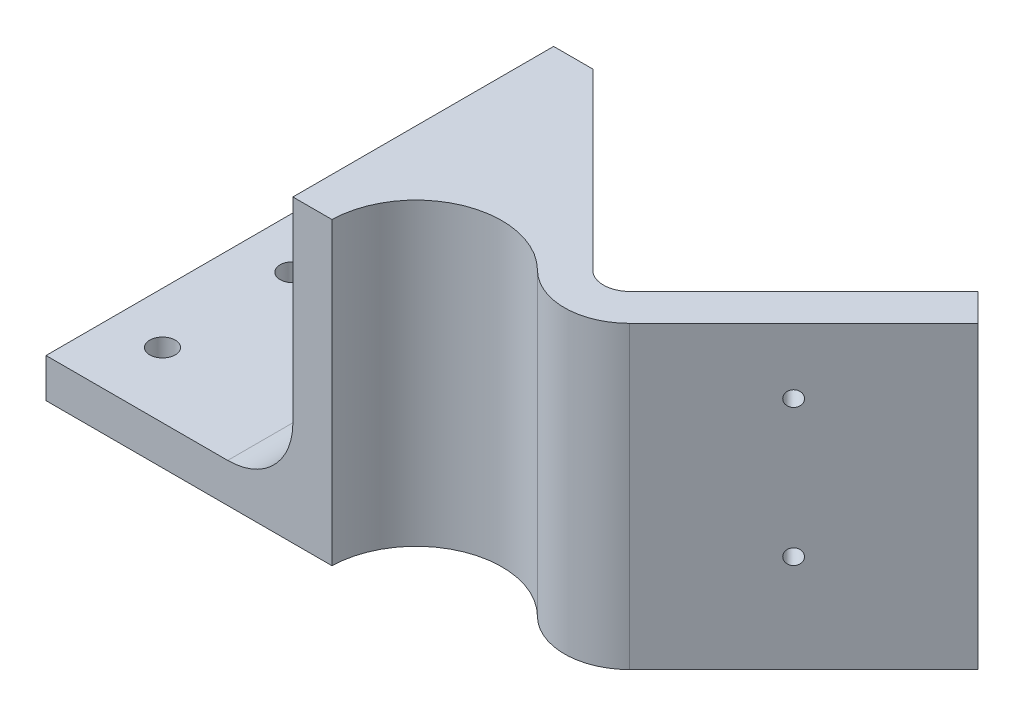
ISO-10303-21;
HEADER;
FILE_DESCRIPTION(('STEP AP214'),'2;1');
FILE_NAME('part.step','',(''),(''),'','','');
FILE_SCHEMA(('AUTOMOTIVE_DESIGN { 1 0 10303 214 1 1 1 1 }'));
ENDSEC;
DATA;
#1=APPLICATION_CONTEXT('core data for automotive mechanical design processes');
#2=APPLICATION_PROTOCOL_DEFINITION('international standard','automotive_design',2000,#1);
#3=PRODUCT_CONTEXT('',#1,'mechanical');
#4=PRODUCT('Part','Part','',(#3));
#5=PRODUCT_RELATED_PRODUCT_CATEGORY('part','',(#4));
#6=PRODUCT_DEFINITION_FORMATION('','',#4);
#7=PRODUCT_DEFINITION_CONTEXT('part definition',#1,'design');
#8=PRODUCT_DEFINITION('design','',#6,#7);
#9=PRODUCT_DEFINITION_SHAPE('','',#8);
#10=(LENGTH_UNIT() NAMED_UNIT(*) SI_UNIT(.MILLI.,.METRE.));
#11=(NAMED_UNIT(*) PLANE_ANGLE_UNIT() SI_UNIT($,.RADIAN.));
#12=(NAMED_UNIT(*) SI_UNIT($,.STERADIAN.) SOLID_ANGLE_UNIT());
#13=UNCERTAINTY_MEASURE_WITH_UNIT(LENGTH_MEASURE(1.E-05),#10,'distance_accuracy_value','');
#14=(GEOMETRIC_REPRESENTATION_CONTEXT(3) GLOBAL_UNCERTAINTY_ASSIGNED_CONTEXT((#13)) GLOBAL_UNIT_ASSIGNED_CONTEXT((#10,
#11,#12)) REPRESENTATION_CONTEXT('',''));
#15=CARTESIAN_POINT('',(0.,0.,0.));
#16=DIRECTION('',(0.,0.,1.));
#17=DIRECTION('',(1.,0.,0.));
#18=AXIS2_PLACEMENT_3D('',#15,#16,#17);
#19=CARTESIAN_POINT('',(0.,50.8,0.));
#20=DIRECTION('',(0.,-1.,0.));
#21=DIRECTION('',(0.,0.,-1.));
#22=AXIS2_PLACEMENT_3D('',#19,#20,#21);
#23=CYLINDRICAL_SURFACE('',#22,5.08);
#24=CARTESIAN_POINT('',(0.,0.,0.));
#25=DIRECTION('',(0.,1.,0.));
#26=DIRECTION('',(0.,0.,1.));
#27=AXIS2_PLACEMENT_3D('',#24,#25,#26);
#28=CIRCLE('',#27,5.08);
#29=CARTESIAN_POINT('',(-3.59210244842766,0.,3.59210244842767));
#30=VERTEX_POINT('',#29);
#31=CARTESIAN_POINT('',(3.59210244842765,0.,3.59210244842767));
#32=VERTEX_POINT('',#31);
#33=EDGE_CURVE('E226',#30,#32,#28,.T.);
#34=ORIENTED_EDGE('',*,*,#33,.F.);
#35=DIRECTION('',(0.,-1.,0.));
#36=VECTOR('',#35,1.);
#37=CARTESIAN_POINT('',(-3.59210244842766,50.8,3.59210244842767));
#38=LINE('',#37,#36);
#39=CARTESIAN_POINT('',(-3.59210244842766,50.8,3.59210244842767));
#40=VERTEX_POINT('',#39);
#41=EDGE_CURVE('E283',#40,#30,#38,.T.);
#42=ORIENTED_EDGE('',*,*,#41,.F.);
#43=CARTESIAN_POINT('',(0.,50.8,0.));
#44=DIRECTION('',(0.,1.,0.));
#45=DIRECTION('',(0.,0.,1.));
#46=AXIS2_PLACEMENT_3D('',#43,#44,#45);
#47=CIRCLE('',#46,5.08);
#48=CARTESIAN_POINT('',(3.59210244842765,50.8,3.59210244842767));
#49=VERTEX_POINT('',#48);
#50=EDGE_CURVE('E231',#40,#49,#47,.T.);
#51=ORIENTED_EDGE('',*,*,#50,.T.);
#52=DIRECTION('',(0.,-1.,0.));
#53=VECTOR('',#52,1.);
#54=CARTESIAN_POINT('',(3.59210244842765,50.8,3.59210244842767));
#55=LINE('',#54,#53);
#56=EDGE_CURVE('E261',#49,#32,#55,.T.);
#57=ORIENTED_EDGE('',*,*,#56,.T.);
#58=EDGE_LOOP('',(#34,#42,#51,#57));
#59=FACE_BOUND('',#58,.T.);
#60=ADVANCED_FACE('F45',(#59),#23,.F.);
#61=CARTESIAN_POINT('',(-3.59210244842765,50.8,3.59210244842767));
#62=DIRECTION('',(-0.707106781186546,0.,0.707106781186549));
#63=DIRECTION('',(0.707106781186549,0.,0.707106781186546));
#64=AXIS2_PLACEMENT_3D('',#61,#62,#63);
#65=PLANE('',#64);
#66=CARTESIAN_POINT('',(-19.5669788146433,38.1,-12.3827739177879));
#67=DIRECTION('',(0.707106781186546,0.,-0.707106781186549));
#68=DIRECTION('',(-0.707106781186549,0.,-0.707106781186546));
#69=AXIS2_PLACEMENT_3D('',#66,#67,#68);
#70=CIRCLE('',#69,1.5);
#71=CARTESIAN_POINT('',(-20.6276389864232,38.1,-13.4434340895678));
#72=VERTEX_POINT('',#71);
#73=EDGE_CURVE('E409',#72,#72,#70,.T.);
#74=ORIENTED_EDGE('',*,*,#73,.F.);
#75=EDGE_LOOP('',(#74));
#76=FACE_BOUND('',#75,.T.);
#77=CARTESIAN_POINT('',(-19.5669788146433,11.43,-12.3827739177879));
#78=DIRECTION('',(0.707106781186546,0.,-0.707106781186549));
#79=DIRECTION('',(-0.707106781186549,0.,-0.707106781186546));
#80=AXIS2_PLACEMENT_3D('',#77,#78,#79);
#81=CIRCLE('',#80,1.5);
#82=CARTESIAN_POINT('',(-20.6276389864232,11.43,-13.4434340895678));
#83=VERTEX_POINT('',#82);
#84=EDGE_CURVE('E411',#83,#83,#81,.T.);
#85=ORIENTED_EDGE('',*,*,#84,.F.);
#86=EDGE_LOOP('',(#85));
#87=FACE_BOUND('',#86,.T.);
#88=DIRECTION('',(-0.707106781186549,0.,-0.707106781186546));
#89=VECTOR('',#88,1.);
#90=CARTESIAN_POINT('',(-3.59210244842765,0.,3.59210244842767));
#91=LINE('',#90,#89);
#92=CARTESIAN_POINT('',(-20.5597967526047,0.,-13.3755918557493));
#93=VERTEX_POINT('',#92);
#94=EDGE_CURVE('E156',#30,#93,#91,.T.);
#95=ORIENTED_EDGE('',*,*,#94,.T.);
#96=DIRECTION('',(0.,1.,0.));
#97=VECTOR('',#96,1.);
#98=CARTESIAN_POINT('',(-20.5597967526047,-7.62,-13.3755918557493));
#99=LINE('',#98,#97);
#100=CARTESIAN_POINT('',(-20.5597967526047,-7.62,-13.3755918557493));
#101=VERTEX_POINT('',#100);
#102=EDGE_CURVE('E150',#101,#93,#99,.T.);
#103=ORIENTED_EDGE('',*,*,#102,.F.);
#104=DIRECTION('',(-0.707106781186549,0.,-0.707106781186546));
#105=VECTOR('',#104,1.);
#106=CARTESIAN_POINT('',(-3.59210244842765,-7.62,3.59210244842767));
#107=LINE('',#106,#105);
#108=CARTESIAN_POINT('',(-37.5274910567817,-7.62,-30.3432861599262));
#109=VERTEX_POINT('',#108);
#110=EDGE_CURVE('E154',#101,#109,#107,.T.);
#111=ORIENTED_EDGE('',*,*,#110,.T.);
#112=DIRECTION('',(0.,-1.,0.));
#113=VECTOR('',#112,1.);
#114=CARTESIAN_POINT('',(-37.5274910567817,50.8,-30.3432861599262));
#115=LINE('',#114,#113);
#116=CARTESIAN_POINT('',(-37.5274910567817,50.8,-30.3432861599262));
#117=VERTEX_POINT('',#116);
#118=EDGE_CURVE('E281',#117,#109,#115,.T.);
#119=ORIENTED_EDGE('',*,*,#118,.F.);
#120=DIRECTION('',(-0.707106781186549,0.,-0.707106781186546));
#121=VECTOR('',#120,1.);
#122=CARTESIAN_POINT('',(-3.59210244842765,50.8,3.59210244842767));
#123=LINE('',#122,#121);
#124=EDGE_CURVE('E234',#40,#117,#123,.T.);
#125=ORIENTED_EDGE('',*,*,#124,.F.);
#126=ORIENTED_EDGE('',*,*,#41,.T.);
#127=EDGE_LOOP('',(#95,#103,#111,#119,#125,#126));
#128=FACE_BOUND('',#127,.T.);
#129=ADVANCED_FACE('F152',(#76,#87,#128),#65,.F.);
#130=CARTESIAN_POINT('',(0.,50.8,-30.3432861599262));
#131=DIRECTION('',(0.,0.,-1.));
#132=DIRECTION('',(-1.,0.,0.));
#133=AXIS2_PLACEMENT_3D('',#130,#131,#132);
#134=PLANE('',#133);
#135=ORIENTED_EDGE('',*,*,#118,.T.);
#136=DIRECTION('',(1.,0.,0.));
#137=VECTOR('',#136,1.);
#138=CARTESIAN_POINT('',(0.,-7.62,-30.3432861599262));
#139=LINE('',#138,#137);
#140=CARTESIAN_POINT('',(-93.2474910567817,-7.62,-30.3432861599262));
#141=VERTEX_POINT('',#140);
#142=EDGE_CURVE('E173',#141,#109,#139,.T.);
#143=ORIENTED_EDGE('',*,*,#142,.F.);
#144=DIRECTION('',(0.,1.,0.));
#145=VECTOR('',#144,1.);
#146=CARTESIAN_POINT('',(-93.2474910567817,-7.62,-30.3432861599262));
#147=LINE('',#146,#145);
#148=CARTESIAN_POINT('',(-93.2474910567817,0.,-30.3432861599262));
#149=VERTEX_POINT('',#148);
#150=EDGE_CURVE('E161',#141,#149,#147,.T.);
#151=ORIENTED_EDGE('',*,*,#150,.T.);
#152=DIRECTION('',(1.,0.,0.));
#153=VECTOR('',#152,1.);
#154=CARTESIAN_POINT('',(0.,0.,-30.3432861599262));
#155=LINE('',#154,#153);
#156=CARTESIAN_POINT('',(-57.8474910567817,0.,-30.3432861599262));
#157=VERTEX_POINT('',#156);
#158=EDGE_CURVE('E215',#149,#157,#155,.T.);
#159=ORIENTED_EDGE('',*,*,#158,.T.);
#160=CARTESIAN_POINT('',(-57.8474910567817,12.7,-30.3432861599262));
#161=DIRECTION('',(0.,0.,-1.));
#162=DIRECTION('',(-1.,0.,0.));
#163=AXIS2_PLACEMENT_3D('',#160,#161,#162);
#164=CIRCLE('',#163,12.7);
#165=CARTESIAN_POINT('',(-45.1474910567817,12.7,-30.3432861599262));
#166=VERTEX_POINT('',#165);
#167=EDGE_CURVE('E53',#157,#166,#164,.F.);
#168=ORIENTED_EDGE('',*,*,#167,.T.);
#169=DIRECTION('',(0.,-1.,0.));
#170=VECTOR('',#169,1.);
#171=CARTESIAN_POINT('',(-45.1474910567817,50.8,-30.3432861599262));
#172=LINE('',#171,#170);
#173=CARTESIAN_POINT('',(-45.1474910567817,50.8,-30.3432861599262));
#174=VERTEX_POINT('',#173);
#175=EDGE_CURVE('E279',#174,#166,#172,.T.);
#176=ORIENTED_EDGE('',*,*,#175,.F.);
#177=DIRECTION('',(1.,0.,0.));
#178=VECTOR('',#177,1.);
#179=CARTESIAN_POINT('',(0.,50.8,-30.3432861599262));
#180=LINE('',#179,#178);
#181=EDGE_CURVE('E237',#174,#117,#180,.T.);
#182=ORIENTED_EDGE('',*,*,#181,.T.);
#183=EDGE_LOOP('',(#135,#143,#151,#159,#168,#176,#182));
#184=FACE_BOUND('',#183,.T.);
#185=ADVANCED_FACE('F296',(#184),#134,.T.);
#186=CARTESIAN_POINT('',(-45.1474910567817,50.8,0.));
#187=DIRECTION('',(-1.,0.,0.));
#188=DIRECTION('',(0.,0.,1.));
#189=AXIS2_PLACEMENT_3D('',#186,#187,#188);
#190=PLANE('',#189);
#191=ORIENTED_EDGE('',*,*,#175,.T.);
#192=DIRECTION('',(0.,0.,-1.));
#193=VECTOR('',#192,1.);
#194=CARTESIAN_POINT('',(-45.1474910567817,12.7,20.4567138400737));
#195=LINE('',#194,#193);
#196=CARTESIAN_POINT('',(-45.1474910567817,12.7,20.4567138400737));
#197=VERTEX_POINT('',#196);
#198=EDGE_CURVE('E66',#166,#197,#195,.F.);
#199=ORIENTED_EDGE('',*,*,#198,.T.);
#200=DIRECTION('',(0.,-1.,0.));
#201=VECTOR('',#200,1.);
#202=CARTESIAN_POINT('',(-45.1474910567817,50.8,20.4567138400737));
#203=LINE('',#202,#201);
#204=CARTESIAN_POINT('',(-45.1474910567817,50.8,20.4567138400737));
#205=VERTEX_POINT('',#204);
#206=EDGE_CURVE('E277',#205,#197,#203,.T.);
#207=ORIENTED_EDGE('',*,*,#206,.F.);
#208=DIRECTION('',(0.,0.,-1.));
#209=VECTOR('',#208,1.);
#210=CARTESIAN_POINT('',(-45.1474910567817,50.8,0.));
#211=LINE('',#210,#209);
#212=EDGE_CURVE('E240',#205,#174,#211,.T.);
#213=ORIENTED_EDGE('',*,*,#212,.T.);
#214=EDGE_LOOP('',(#191,#199,#207,#213));
#215=FACE_BOUND('',#214,.T.);
#216=ADVANCED_FACE('F325',(#215),#190,.T.);
#217=CARTESIAN_POINT('',(0.,50.8,20.4567138400737));
#218=DIRECTION('',(0.,0.,1.));
#219=DIRECTION('',(1.,0.,0.));
#220=AXIS2_PLACEMENT_3D('',#217,#218,#219);
#221=PLANE('',#220);
#222=ORIENTED_EDGE('',*,*,#206,.T.);
#223=CARTESIAN_POINT('',(-57.8474910567817,12.7,20.4567138400737));
#224=DIRECTION('',(0.,0.,1.));
#225=DIRECTION('',(1.,0.,0.));
#226=AXIS2_PLACEMENT_3D('',#223,#224,#225);
#227=CIRCLE('',#226,12.7);
#228=CARTESIAN_POINT('',(-57.8474910567817,0.,20.4567138400737));
#229=VERTEX_POINT('',#228);
#230=EDGE_CURVE('E11',#197,#229,#227,.F.);
#231=ORIENTED_EDGE('',*,*,#230,.T.);
#232=DIRECTION('',(-1.,0.,0.));
#233=VECTOR('',#232,1.);
#234=CARTESIAN_POINT('',(0.,0.,20.4567138400737));
#235=LINE('',#234,#233);
#236=CARTESIAN_POINT('',(-93.2474910567817,0.,20.4567138400738));
#237=VERTEX_POINT('',#236);
#238=EDGE_CURVE('E221',#229,#237,#235,.T.);
#239=ORIENTED_EDGE('',*,*,#238,.T.);
#240=DIRECTION('',(0.,1.,0.));
#241=VECTOR('',#240,1.);
#242=CARTESIAN_POINT('',(-93.2474910567817,-7.62,20.4567138400738));
#243=LINE('',#242,#241);
#244=CARTESIAN_POINT('',(-93.2474910567817,-7.62,20.4567138400738));
#245=VERTEX_POINT('',#244);
#246=EDGE_CURVE('E227',#245,#237,#243,.T.);
#247=ORIENTED_EDGE('',*,*,#246,.F.);
#248=DIRECTION('',(-1.,0.,0.));
#249=VECTOR('',#248,1.);
#250=CARTESIAN_POINT('',(0.,-7.62,20.4567138400737));
#251=LINE('',#250,#249);
#252=CARTESIAN_POINT('',(-37.5274910567817,-7.62,20.4567138400737));
#253=VERTEX_POINT('',#252);
#254=EDGE_CURVE('E192',#253,#245,#251,.T.);
#255=ORIENTED_EDGE('',*,*,#254,.F.);
#256=DIRECTION('',(0.,-1.,0.));
#257=VECTOR('',#256,1.);
#258=CARTESIAN_POINT('',(-37.5274910567817,50.8,20.4567138400737));
#259=LINE('',#258,#257);
#260=CARTESIAN_POINT('',(-37.5274910567817,50.8,20.4567138400737));
#261=VERTEX_POINT('',#260);
#262=EDGE_CURVE('E275',#261,#253,#259,.T.);
#263=ORIENTED_EDGE('',*,*,#262,.F.);
#264=DIRECTION('',(-1.,0.,0.));
#265=VECTOR('',#264,1.);
#266=CARTESIAN_POINT('',(0.,50.8,20.4567138400737));
#267=LINE('',#266,#265);
#268=EDGE_CURVE('E243',#261,#205,#267,.T.);
#269=ORIENTED_EDGE('',*,*,#268,.T.);
#270=EDGE_LOOP('',(#222,#231,#239,#247,#255,#263,#269));
#271=FACE_BOUND('',#270,.T.);
#272=ADVANCED_FACE('F302',(#271),#221,.T.);
#273=CARTESIAN_POINT('',(-20.8064225922342,50.8,20.8064225922343));
#274=DIRECTION('',(0.,-1.,0.));
#275=DIRECTION('',(0.,0.,-1.));
#276=AXIS2_PLACEMENT_3D('',#273,#274,#275);
#277=CYLINDRICAL_SURFACE('',#276,16.7247250144037);
#278=ORIENTED_EDGE('',*,*,#262,.T.);
#279=CARTESIAN_POINT('',(-20.8064225922342,-7.62,20.8064225922343));
#280=DIRECTION('',(0.,1.,0.));
#281=DIRECTION('',(0.,0.,1.));
#282=AXIS2_PLACEMENT_3D('',#279,#280,#281);
#283=CIRCLE('',#282,16.7247250144037);
#284=CARTESIAN_POINT('',(-8.98025612106912,-7.62,8.98025612106917));
#285=VERTEX_POINT('',#284);
#286=EDGE_CURVE('E194',#285,#253,#283,.T.);
#287=ORIENTED_EDGE('',*,*,#286,.F.);
#288=DIRECTION('',(0.,-1.,0.));
#289=VECTOR('',#288,1.);
#290=CARTESIAN_POINT('',(-8.98025612106912,50.8,8.98025612106917));
#291=LINE('',#290,#289);
#292=CARTESIAN_POINT('',(-8.98025612106912,50.8,8.98025612106917));
#293=VERTEX_POINT('',#292);
#294=EDGE_CURVE('E273',#293,#285,#291,.T.);
#295=ORIENTED_EDGE('',*,*,#294,.F.);
#296=CARTESIAN_POINT('',(-20.8064225922342,50.8,20.8064225922343));
#297=DIRECTION('',(0.,1.,0.));
#298=DIRECTION('',(0.,0.,1.));
#299=AXIS2_PLACEMENT_3D('',#296,#297,#298);
#300=CIRCLE('',#299,16.7247250144037);
#301=EDGE_CURVE('E246',#293,#261,#300,.T.);
#302=ORIENTED_EDGE('',*,*,#301,.T.);
#303=EDGE_LOOP('',(#278,#287,#295,#302));
#304=FACE_BOUND('',#303,.T.);
#305=ADVANCED_FACE('F330',(#304),#277,.F.);
#306=CARTESIAN_POINT('',(0.,50.8,0.));
#307=DIRECTION('',(0.,-1.,0.));
#308=DIRECTION('',(0.,0.,-1.));
#309=AXIS2_PLACEMENT_3D('',#306,#307,#308);
#310=CYLINDRICAL_SURFACE('',#309,12.7);
#311=ORIENTED_EDGE('',*,*,#294,.T.);
#312=CARTESIAN_POINT('',(0.,-7.62,0.));
#313=DIRECTION('',(0.,1.,0.));
#314=DIRECTION('',(0.,0.,1.));
#315=AXIS2_PLACEMENT_3D('',#312,#313,#314);
#316=CIRCLE('',#315,12.7);
#317=CARTESIAN_POINT('',(8.98025612106913,-7.62,8.98025612106916));
#318=VERTEX_POINT('',#317);
#319=EDGE_CURVE('E197',#318,#285,#316,.F.);
#320=ORIENTED_EDGE('',*,*,#319,.F.);
#321=DIRECTION('',(0.,-1.,0.));
#322=VECTOR('',#321,1.);
#323=CARTESIAN_POINT('',(8.98025612106913,50.8,8.98025612106916));
#324=LINE('',#323,#322);
#325=CARTESIAN_POINT('',(8.98025612106913,50.8,8.98025612106916));
#326=VERTEX_POINT('',#325);
#327=EDGE_CURVE('E271',#326,#318,#324,.T.);
#328=ORIENTED_EDGE('',*,*,#327,.F.);
#329=CARTESIAN_POINT('',(0.,50.8,0.));
#330=DIRECTION('',(0.,1.,0.));
#331=DIRECTION('',(0.,0.,1.));
#332=AXIS2_PLACEMENT_3D('',#329,#330,#331);
#333=CIRCLE('',#332,12.7);
#334=EDGE_CURVE('E249',#326,#293,#333,.F.);
#335=ORIENTED_EDGE('',*,*,#334,.T.);
#336=EDGE_LOOP('',(#311,#320,#328,#335));
#337=FACE_BOUND('',#336,.T.);
#338=ADVANCED_FACE('F332',(#337),#310,.T.);
#339=CARTESIAN_POINT('',(8.98025612106913,50.8,8.98025612106917));
#340=DIRECTION('',(0.707106781186546,0.,0.707106781186549));
#341=DIRECTION('',(0.707106781186549,0.,-0.707106781186546));
#342=AXIS2_PLACEMENT_3D('',#339,#340,#341);
#343=PLANE('',#342);
#344=CARTESIAN_POINT('',(24.9551324872848,38.1,-6.99462024514645));
#345=DIRECTION('',(0.707106781186546,0.,0.707106781186549));
#346=DIRECTION('',(0.707106781186549,0.,-0.707106781186546));
#347=AXIS2_PLACEMENT_3D('',#344,#345,#346);
#348=CIRCLE('',#347,1.5);
#349=CARTESIAN_POINT('',(26.0157926590646,38.1,-8.05528041692627));
#350=VERTEX_POINT('',#349);
#351=EDGE_CURVE('E404',#350,#350,#348,.T.);
#352=ORIENTED_EDGE('',*,*,#351,.F.);
#353=EDGE_LOOP('',(#352));
#354=FACE_BOUND('',#353,.T.);
#355=CARTESIAN_POINT('',(24.9551324872848,11.43,-6.99462024514645));
#356=DIRECTION('',(0.707106781186546,0.,0.707106781186549));
#357=DIRECTION('',(0.707106781186549,0.,-0.707106781186546));
#358=AXIS2_PLACEMENT_3D('',#355,#356,#357);
#359=CIRCLE('',#358,1.5);
#360=CARTESIAN_POINT('',(26.0157926590646,11.43,-8.05528041692627));
#361=VERTEX_POINT('',#360);
#362=EDGE_CURVE('E393',#361,#361,#359,.T.);
#363=ORIENTED_EDGE('',*,*,#362,.F.);
#364=EDGE_LOOP('',(#363));
#365=FACE_BOUND('',#364,.T.);
#366=ORIENTED_EDGE('',*,*,#327,.T.);
#367=DIRECTION('',(-0.707106781186549,0.,0.707106781186546));
#368=VECTOR('',#367,1.);
#369=CARTESIAN_POINT('',(8.98025612106913,-7.62,8.98025612106917));
#370=LINE('',#369,#368);
#371=CARTESIAN_POINT('',(42.9156447294232,-7.62,-24.9551324872847));
#372=VERTEX_POINT('',#371);
#373=EDGE_CURVE('E200',#372,#318,#370,.T.);
#374=ORIENTED_EDGE('',*,*,#373,.F.);
#375=DIRECTION('',(0.,-1.,0.));
#376=VECTOR('',#375,1.);
#377=CARTESIAN_POINT('',(42.9156447294232,50.8,-24.9551324872847));
#378=LINE('',#377,#376);
#379=CARTESIAN_POINT('',(42.9156447294232,50.8,-24.9551324872847));
#380=VERTEX_POINT('',#379);
#381=EDGE_CURVE('E269',#380,#372,#378,.T.);
#382=ORIENTED_EDGE('',*,*,#381,.F.);
#383=DIRECTION('',(-0.707106781186549,0.,0.707106781186546));
#384=VECTOR('',#383,1.);
#385=CARTESIAN_POINT('',(8.98025612106913,50.8,8.98025612106917));
#386=LINE('',#385,#384);
#387=EDGE_CURVE('E252',#380,#326,#386,.T.);
#388=ORIENTED_EDGE('',*,*,#387,.T.);
#389=EDGE_LOOP('',(#366,#374,#382,#388));
#390=FACE_BOUND('',#389,.T.);
#391=ADVANCED_FACE('F336',(#354,#365,#390),#343,.T.);
#392=CARTESIAN_POINT('',(33.935388608354,50.8,-33.9353886083539));
#393=DIRECTION('',(0.707106781186548,0.,-0.707106781186546));
#394=DIRECTION('',(-0.707106781186547,0.,-0.707106781186549));
#395=AXIS2_PLACEMENT_3D('',#392,#393,#394);
#396=PLANE('',#395);
#397=ORIENTED_EDGE('',*,*,#381,.T.);
#398=DIRECTION('',(0.707106781186546,0.,0.707106781186549));
#399=VECTOR('',#398,1.);
#400=CARTESIAN_POINT('',(33.935388608354,-7.62,-33.9353886083539));
#401=LINE('',#400,#399);
#402=CARTESIAN_POINT('',(37.5274910567817,-7.62,-30.3432861599262));
#403=VERTEX_POINT('',#402);
#404=EDGE_CURVE('E203',#403,#372,#401,.T.);
#405=ORIENTED_EDGE('',*,*,#404,.F.);
#406=DIRECTION('',(0.,-1.,0.));
#407=VECTOR('',#406,1.);
#408=CARTESIAN_POINT('',(37.5274910567817,50.8,-30.3432861599262));
#409=LINE('',#408,#407);
#410=CARTESIAN_POINT('',(37.5274910567817,50.8,-30.3432861599262));
#411=VERTEX_POINT('',#410);
#412=EDGE_CURVE('E267',#411,#403,#409,.T.);
#413=ORIENTED_EDGE('',*,*,#412,.F.);
#414=DIRECTION('',(0.707106781186546,0.,0.707106781186549));
#415=VECTOR('',#414,1.);
#416=CARTESIAN_POINT('',(33.935388608354,50.8,-33.9353886083539));
#417=LINE('',#416,#415);
#418=EDGE_CURVE('E255',#411,#380,#417,.T.);
#419=ORIENTED_EDGE('',*,*,#418,.T.);
#420=EDGE_LOOP('',(#397,#405,#413,#419));
#421=FACE_BOUND('',#420,.T.);
#422=ADVANCED_FACE('F340',(#421),#396,.T.);
#423=CARTESIAN_POINT('',(3.59210244842765,50.8,3.59210244842767));
#424=DIRECTION('',(-0.707106781186546,0.,-0.707106781186549));
#425=DIRECTION('',(-0.707106781186549,0.,0.707106781186546));
#426=AXIS2_PLACEMENT_3D('',#423,#424,#425);
#427=PLANE('',#426);
#428=CARTESIAN_POINT('',(19.5669788146433,38.1,-12.382773917788));
#429=DIRECTION('',(-0.707106781186546,0.,-0.707106781186549));
#430=DIRECTION('',(-0.707106781186549,0.,0.707106781186546));
#431=AXIS2_PLACEMENT_3D('',#428,#429,#430);
#432=CIRCLE('',#431,1.5);
#433=CARTESIAN_POINT('',(18.5063186428635,38.1,-11.3221137460081));
#434=VERTEX_POINT('',#433);
#435=EDGE_CURVE('E398',#434,#434,#432,.T.);
#436=ORIENTED_EDGE('',*,*,#435,.F.);
#437=EDGE_LOOP('',(#436));
#438=FACE_BOUND('',#437,.T.);
#439=CARTESIAN_POINT('',(19.5669788146433,11.43,-12.382773917788));
#440=DIRECTION('',(-0.707106781186546,0.,-0.707106781186549));
#441=DIRECTION('',(-0.707106781186549,0.,0.707106781186546));
#442=AXIS2_PLACEMENT_3D('',#439,#440,#441);
#443=CIRCLE('',#442,1.5);
#444=CARTESIAN_POINT('',(18.5063186428635,11.43,-11.3221137460081));
#445=VERTEX_POINT('',#444);
#446=EDGE_CURVE('E396',#445,#445,#443,.T.);
#447=ORIENTED_EDGE('',*,*,#446,.F.);
#448=EDGE_LOOP('',(#447));
#449=FACE_BOUND('',#448,.T.);
#450=DIRECTION('',(0.707106781186549,0.,-0.707106781186546));
#451=VECTOR('',#450,1.);
#452=CARTESIAN_POINT('',(3.59210244842765,0.,3.59210244842767));
#453=LINE('',#452,#451);
#454=CARTESIAN_POINT('',(20.5597967526047,0.,-13.3755918557493));
#455=VERTEX_POINT('',#454);
#456=EDGE_CURVE('E235',#32,#455,#453,.T.);
#457=ORIENTED_EDGE('',*,*,#456,.F.);
#458=ORIENTED_EDGE('',*,*,#56,.F.);
#459=DIRECTION('',(0.707106781186549,0.,-0.707106781186546));
#460=VECTOR('',#459,1.);
#461=CARTESIAN_POINT('',(3.59210244842765,50.8,3.59210244842767));
#462=LINE('',#461,#460);
#463=EDGE_CURVE('E258',#49,#411,#462,.T.);
#464=ORIENTED_EDGE('',*,*,#463,.T.);
#465=ORIENTED_EDGE('',*,*,#412,.T.);
#466=DIRECTION('',(0.707106781186549,0.,-0.707106781186546));
#467=VECTOR('',#466,1.);
#468=CARTESIAN_POINT('',(3.59210244842765,-7.62,3.59210244842767));
#469=LINE('',#468,#467);
#470=CARTESIAN_POINT('',(20.5597967526047,-7.62,-13.3755918557493));
#471=VERTEX_POINT('',#470);
#472=EDGE_CURVE('E206',#471,#403,#469,.T.);
#473=ORIENTED_EDGE('',*,*,#472,.F.);
#474=DIRECTION('',(0.,1.,0.));
#475=VECTOR('',#474,1.);
#476=CARTESIAN_POINT('',(20.5597967526047,-7.62,-13.3755918557493));
#477=LINE('',#476,#475);
#478=EDGE_CURVE('E177',#471,#455,#477,.T.);
#479=ORIENTED_EDGE('',*,*,#478,.T.);
#480=EDGE_LOOP('',(#457,#458,#464,#465,#473,#479));
#481=FACE_BOUND('',#480,.T.);
#482=ADVANCED_FACE('F344',(#438,#449,#481),#427,.T.);
#483=CARTESIAN_POINT('',(0.,50.8,0.));
#484=DIRECTION('',(0.,1.,0.));
#485=DIRECTION('',(0.,0.,1.));
#486=AXIS2_PLACEMENT_3D('',#483,#484,#485);
#487=PLANE('',#486);
#488=ORIENTED_EDGE('',*,*,#50,.F.);
#489=ORIENTED_EDGE('',*,*,#124,.T.);
#490=ORIENTED_EDGE('',*,*,#181,.F.);
#491=ORIENTED_EDGE('',*,*,#212,.F.);
#492=ORIENTED_EDGE('',*,*,#268,.F.);
#493=ORIENTED_EDGE('',*,*,#301,.F.);
#494=ORIENTED_EDGE('',*,*,#334,.F.);
#495=ORIENTED_EDGE('',*,*,#387,.F.);
#496=ORIENTED_EDGE('',*,*,#418,.F.);
#497=ORIENTED_EDGE('',*,*,#463,.F.);
#498=EDGE_LOOP('',(#488,#489,#490,#491,#492,#493,#494,#495,#496,#497));
#499=FACE_BOUND('',#498,.T.);
#500=ADVANCED_FACE('F348',(#499),#487,.T.);
#501=CARTESIAN_POINT('',(0.,0.,0.));
#502=DIRECTION('',(0.,1.,0.));
#503=DIRECTION('',(0.,0.,1.));
#504=AXIS2_PLACEMENT_3D('',#501,#502,#503);
#505=PLANE('',#504);
#506=CARTESIAN_POINT('',(-83.2474910567817,0.,-17.6432861599262));
#507=DIRECTION('',(0.,1.,0.));
#508=DIRECTION('',(0.,0.,1.));
#509=AXIS2_PLACEMENT_3D('',#506,#507,#508);
#510=CIRCLE('',#509,2.50000000000001);
#511=CARTESIAN_POINT('',(-83.2474910567817,0.,-15.1432861599262));
#512=VERTEX_POINT('',#511);
#513=EDGE_CURVE('E179',#512,#512,#510,.T.);
#514=ORIENTED_EDGE('',*,*,#513,.F.);
#515=EDGE_LOOP('',(#514));
#516=FACE_BOUND('',#515,.T.);
#517=CARTESIAN_POINT('',(-83.2474910567817,0.,7.75671384007379));
#518=DIRECTION('',(0.,1.,0.));
#519=DIRECTION('',(0.,0.,1.));
#520=AXIS2_PLACEMENT_3D('',#517,#518,#519);
#521=CIRCLE('',#520,2.50000000000001);
#522=CARTESIAN_POINT('',(-83.2474910567817,0.,10.2567138400738));
#523=VERTEX_POINT('',#522);
#524=EDGE_CURVE('E182',#523,#523,#521,.T.);
#525=ORIENTED_EDGE('',*,*,#524,.F.);
#526=EDGE_LOOP('',(#525));
#527=FACE_BOUND('',#526,.T.);
#528=ORIENTED_EDGE('',*,*,#238,.F.);
#529=DIRECTION('',(0.,0.,-1.));
#530=VECTOR('',#529,1.);
#531=CARTESIAN_POINT('',(-57.8474910567817,0.,-30.3432861599262));
#532=LINE('',#531,#530);
#533=EDGE_CURVE('E285',#229,#157,#532,.T.);
#534=ORIENTED_EDGE('',*,*,#533,.T.);
#535=ORIENTED_EDGE('',*,*,#158,.F.);
#536=DIRECTION('',(0.,0.,1.));
#537=VECTOR('',#536,1.);
#538=CARTESIAN_POINT('',(-93.2474910567817,0.,0.));
#539=LINE('',#538,#537);
#540=EDGE_CURVE('E218',#149,#237,#539,.T.);
#541=ORIENTED_EDGE('',*,*,#540,.T.);
#542=EDGE_LOOP('',(#528,#534,#535,#541));
#543=FACE_BOUND('',#542,.T.);
#544=ADVANCED_FACE('F292',(#516,#527,#543),#505,.T.);
#545=CARTESIAN_POINT('',(0.,-7.62,-13.3755918557493));
#546=DIRECTION('',(0.,0.,-1.));
#547=DIRECTION('',(-1.,0.,0.));
#548=AXIS2_PLACEMENT_3D('',#545,#546,#547);
#549=PLANE('',#548);
#550=DIRECTION('',(-1.,0.,0.));
#551=VECTOR('',#550,1.);
#552=CARTESIAN_POINT('',(0.,0.,-13.3755918557493));
#553=LINE('',#552,#551);
#554=EDGE_CURVE('E213',#455,#93,#553,.T.);
#555=ORIENTED_EDGE('',*,*,#554,.F.);
#556=ORIENTED_EDGE('',*,*,#478,.F.);
#557=DIRECTION('',(-1.,0.,0.));
#558=VECTOR('',#557,1.);
#559=CARTESIAN_POINT('',(0.,-7.62,-13.3755918557493));
#560=LINE('',#559,#558);
#561=EDGE_CURVE('E170',#471,#101,#560,.T.);
#562=ORIENTED_EDGE('',*,*,#561,.T.);
#563=ORIENTED_EDGE('',*,*,#102,.T.);
#564=EDGE_LOOP('',(#555,#556,#562,#563));
#565=FACE_BOUND('',#564,.T.);
#566=ADVANCED_FACE('F175',(#565),#549,.T.);
#567=CARTESIAN_POINT('',(-93.2474910567817,-7.62,0.));
#568=DIRECTION('',(-1.,0.,0.));
#569=DIRECTION('',(0.,0.,1.));
#570=AXIS2_PLACEMENT_3D('',#567,#568,#569);
#571=PLANE('',#570);
#572=ORIENTED_EDGE('',*,*,#540,.F.);
#573=ORIENTED_EDGE('',*,*,#150,.F.);
#574=DIRECTION('',(0.,0.,1.));
#575=VECTOR('',#574,1.);
#576=CARTESIAN_POINT('',(-93.2474910567817,-7.62,0.));
#577=LINE('',#576,#575);
#578=EDGE_CURVE('E189',#141,#245,#577,.T.);
#579=ORIENTED_EDGE('',*,*,#578,.T.);
#580=ORIENTED_EDGE('',*,*,#246,.T.);
#581=EDGE_LOOP('',(#572,#573,#579,#580));
#582=FACE_BOUND('',#581,.T.);
#583=ADVANCED_FACE('F298',(#582),#571,.T.);
#584=CARTESIAN_POINT('',(-83.2474910567817,-7.62,7.75671384007379));
#585=DIRECTION('',(0.,1.,0.));
#586=DIRECTION('',(0.,0.,1.));
#587=AXIS2_PLACEMENT_3D('',#584,#585,#586);
#588=CYLINDRICAL_SURFACE('',#587,2.50000000000001);
#589=CARTESIAN_POINT('',(-83.2474910567817,-7.62,7.75671384007379));
#590=DIRECTION('',(0.,1.,0.));
#591=DIRECTION('',(0.,0.,1.));
#592=AXIS2_PLACEMENT_3D('',#589,#590,#591);
#593=CIRCLE('',#592,2.50000000000001);
#594=CARTESIAN_POINT('',(-83.2474910567817,-7.62,10.2567138400738));
#595=VERTEX_POINT('',#594);
#596=EDGE_CURVE('E208',#595,#595,#593,.T.);
#597=CARTESIAN_POINT('',(-83.2474910567817,-7.62,10.2567138400738));
#598=CARTESIAN_POINT('',(-83.2474910567817,-7.540625,10.2567138400738));
#599=CARTESIAN_POINT('',(-83.2474910567817,-7.46125,10.2567138400738));
#600=CARTESIAN_POINT('',(-83.2474910567817,-7.3025,10.2567138400738));
#601=CARTESIAN_POINT('',(-83.2474910567817,-7.223125,10.2567138400738));
#602=CARTESIAN_POINT('',(-83.2474910567817,-7.064375,10.2567138400738));
#603=CARTESIAN_POINT('',(-83.2474910567817,-6.985,10.2567138400738));
#604=CARTESIAN_POINT('',(-83.2474910567817,-6.82625,10.2567138400738));
#605=CARTESIAN_POINT('',(-83.2474910567817,-6.746875,10.2567138400738));
#606=CARTESIAN_POINT('',(-83.2474910567817,-6.588125,10.2567138400738));
#607=CARTESIAN_POINT('',(-83.2474910567817,-6.50875,10.2567138400738));
#608=CARTESIAN_POINT('',(-83.2474910567817,-6.35,10.2567138400738));
#609=CARTESIAN_POINT('',(-83.2474910567817,-6.270625,10.2567138400738));
#610=CARTESIAN_POINT('',(-83.2474910567817,-6.111875,10.2567138400738));
#611=CARTESIAN_POINT('',(-83.2474910567817,-6.0325,10.2567138400738));
#612=CARTESIAN_POINT('',(-83.2474910567817,-5.87375,10.2567138400738));
#613=CARTESIAN_POINT('',(-83.2474910567817,-5.794375,10.2567138400738));
#614=CARTESIAN_POINT('',(-83.2474910567817,-5.635625,10.2567138400738));
#615=CARTESIAN_POINT('',(-83.2474910567817,-5.55625,10.2567138400738));
#616=CARTESIAN_POINT('',(-83.2474910567817,-5.3975,10.2567138400738));
#617=CARTESIAN_POINT('',(-83.2474910567817,-5.318125,10.2567138400738));
#618=CARTESIAN_POINT('',(-83.2474910567817,-5.159375,10.2567138400738));
#619=CARTESIAN_POINT('',(-83.2474910567817,-5.08,10.2567138400738));
#620=CARTESIAN_POINT('',(-83.2474910567817,-4.92125,10.2567138400738));
#621=CARTESIAN_POINT('',(-83.2474910567817,-4.841875,10.2567138400738));
#622=CARTESIAN_POINT('',(-83.2474910567817,-4.683125,10.2567138400738));
#623=CARTESIAN_POINT('',(-83.2474910567817,-4.60375,10.2567138400738));
#624=CARTESIAN_POINT('',(-83.2474910567817,-4.445,10.2567138400738));
#625=CARTESIAN_POINT('',(-83.2474910567817,-4.365625,10.2567138400738));
#626=CARTESIAN_POINT('',(-83.2474910567817,-4.206875,10.2567138400738));
#627=CARTESIAN_POINT('',(-83.2474910567817,-4.1275,10.2567138400738));
#628=CARTESIAN_POINT('',(-83.2474910567817,-3.96875,10.2567138400738));
#629=CARTESIAN_POINT('',(-83.2474910567817,-3.889375,10.2567138400738));
#630=CARTESIAN_POINT('',(-83.2474910567817,-3.730625,10.2567138400738));
#631=CARTESIAN_POINT('',(-83.2474910567817,-3.65125,10.2567138400738));
#632=CARTESIAN_POINT('',(-83.2474910567817,-3.4925,10.2567138400738));
#633=CARTESIAN_POINT('',(-83.2474910567817,-3.413125,10.2567138400738));
#634=CARTESIAN_POINT('',(-83.2474910567817,-3.254375,10.2567138400738));
#635=CARTESIAN_POINT('',(-83.2474910567817,-3.175,10.2567138400738));
#636=CARTESIAN_POINT('',(-83.2474910567817,-3.01625,10.2567138400738));
#637=CARTESIAN_POINT('',(-83.2474910567817,-2.936875,10.2567138400738));
#638=CARTESIAN_POINT('',(-83.2474910567817,-2.778125,10.2567138400738));
#639=CARTESIAN_POINT('',(-83.2474910567817,-2.69875,10.2567138400738));
#640=CARTESIAN_POINT('',(-83.2474910567817,-2.54,10.2567138400738));
#641=CARTESIAN_POINT('',(-83.2474910567817,-2.460625,10.2567138400738));
#642=CARTESIAN_POINT('',(-83.2474910567817,-2.301875,10.2567138400738));
#643=CARTESIAN_POINT('',(-83.2474910567817,-2.2225,10.2567138400738));
#644=CARTESIAN_POINT('',(-83.2474910567817,-2.06375,10.2567138400738));
#645=CARTESIAN_POINT('',(-83.2474910567817,-1.984375,10.2567138400738));
#646=CARTESIAN_POINT('',(-83.2474910567817,-1.825625,10.2567138400738));
#647=CARTESIAN_POINT('',(-83.2474910567817,-1.74625,10.2567138400738));
#648=CARTESIAN_POINT('',(-83.2474910567817,-1.5875,10.2567138400738));
#649=CARTESIAN_POINT('',(-83.2474910567817,-1.508125,10.2567138400738));
#650=CARTESIAN_POINT('',(-83.2474910567817,-1.349375,10.2567138400738));
#651=CARTESIAN_POINT('',(-83.2474910567817,-1.27,10.2567138400738));
#652=CARTESIAN_POINT('',(-83.2474910567817,-1.11125,10.2567138400738));
#653=CARTESIAN_POINT('',(-83.2474910567817,-1.031875,10.2567138400738));
#654=CARTESIAN_POINT('',(-83.2474910567817,-0.873125,10.2567138400738));
#655=CARTESIAN_POINT('',(-83.2474910567817,-0.79375,10.2567138400738));
#656=CARTESIAN_POINT('',(-83.2474910567817,-0.635,10.2567138400738));
#657=CARTESIAN_POINT('',(-83.2474910567817,-0.555625,10.2567138400738));
#658=CARTESIAN_POINT('',(-83.2474910567817,-0.396875,10.2567138400738));
#659=CARTESIAN_POINT('',(-83.2474910567817,-0.3175,10.2567138400738));
#660=CARTESIAN_POINT('',(-83.2474910567817,-0.15875,10.2567138400738));
#661=CARTESIAN_POINT('',(-83.2474910567817,-0.0793749999999999,10.2567138400738));
#662=CARTESIAN_POINT('',(-83.2474910567817,0.,10.2567138400738));
#663=B_SPLINE_CURVE_WITH_KNOTS('',3,(#597,#598,#599,#600,#601,#602,#603,#604,#605,#606,#607,
#608,#609,#610,#611,#612,#613,#614,#615,#616,#617,#618,#619,#620,#621,#622,#623,#624,#625,#626,
#627,#628,#629,#630,#631,#632,#633,#634,#635,#636,#637,#638,#639,#640,#641,#642,#643,#644,#645,
#646,#647,#648,#649,#650,#651,#652,#653,#654,#655,#656,#657,#658,#659,#660,#661,#662),
.UNSPECIFIED.,.F.,.F.,(4,2,2,2,2,2,2,2,2,2,2,2,2,2,2,2,2,2,2,2,2,2,2,2,2,2,2,2,2,2,2,2,4),(0.,
0.238125,0.476249999999999,0.714375,0.952499999999999,1.190625,1.42875,1.666875,1.905,2.143125,
2.38125,2.619375,2.8575,3.095625,3.33375,3.571875,3.81,4.048125,4.28625,4.524375,4.7625,
5.000625,5.23875,5.476875,5.715,5.953125,6.19125,6.429375,6.6675,6.905625,7.14375,7.381875,
7.62),.UNSPECIFIED.);
#664=EDGE_CURVE('BSEAM356',#595,#523,#663,.T.);
#665=ORIENTED_EDGE('',*,*,#596,.F.);
#666=ORIENTED_EDGE('',*,*,#524,.T.);
#667=ORIENTED_EDGE('',*,*,#664,.T.);
#668=ORIENTED_EDGE('',*,*,#664,.F.);
#669=EDGE_LOOP('',(#665,#667,#666,#668));
#670=FACE_BOUND('',#669,.T.);
#671=ADVANCED_FACE('F356',(#670),#588,.F.);
#672=CARTESIAN_POINT('',(-83.2474910567817,-7.62,-17.6432861599262));
#673=DIRECTION('',(0.,1.,0.));
#674=DIRECTION('',(0.,0.,1.));
#675=AXIS2_PLACEMENT_3D('',#672,#673,#674);
#676=CYLINDRICAL_SURFACE('',#675,2.50000000000001);
#677=CARTESIAN_POINT('',(-83.2474910567817,-7.62,-17.6432861599262));
#678=DIRECTION('',(0.,1.,0.));
#679=DIRECTION('',(0.,0.,1.));
#680=AXIS2_PLACEMENT_3D('',#677,#678,#679);
#681=CIRCLE('',#680,2.50000000000001);
#682=CARTESIAN_POINT('',(-83.2474910567817,-7.62,-15.1432861599262));
#683=VERTEX_POINT('',#682);
#684=EDGE_CURVE('E162',#683,#683,#681,.T.);
#685=CARTESIAN_POINT('',(-83.2474910567817,-7.62,-15.1432861599262));
#686=CARTESIAN_POINT('',(-83.2474910567817,-7.540625,-15.1432861599262));
#687=CARTESIAN_POINT('',(-83.2474910567817,-7.46125,-15.1432861599262));
#688=CARTESIAN_POINT('',(-83.2474910567817,-7.3025,-15.1432861599262));
#689=CARTESIAN_POINT('',(-83.2474910567817,-7.223125,-15.1432861599262));
#690=CARTESIAN_POINT('',(-83.2474910567817,-7.064375,-15.1432861599262));
#691=CARTESIAN_POINT('',(-83.2474910567817,-6.985,-15.1432861599262));
#692=CARTESIAN_POINT('',(-83.2474910567817,-6.82625,-15.1432861599262));
#693=CARTESIAN_POINT('',(-83.2474910567817,-6.746875,-15.1432861599262));
#694=CARTESIAN_POINT('',(-83.2474910567817,-6.588125,-15.1432861599262));
#695=CARTESIAN_POINT('',(-83.2474910567817,-6.50875,-15.1432861599262));
#696=CARTESIAN_POINT('',(-83.2474910567817,-6.35,-15.1432861599262));
#697=CARTESIAN_POINT('',(-83.2474910567817,-6.270625,-15.1432861599262));
#698=CARTESIAN_POINT('',(-83.2474910567817,-6.111875,-15.1432861599262));
#699=CARTESIAN_POINT('',(-83.2474910567817,-6.0325,-15.1432861599262));
#700=CARTESIAN_POINT('',(-83.2474910567817,-5.87375,-15.1432861599262));
#701=CARTESIAN_POINT('',(-83.2474910567817,-5.794375,-15.1432861599262));
#702=CARTESIAN_POINT('',(-83.2474910567817,-5.635625,-15.1432861599262));
#703=CARTESIAN_POINT('',(-83.2474910567817,-5.55625,-15.1432861599262));
#704=CARTESIAN_POINT('',(-83.2474910567817,-5.3975,-15.1432861599262));
#705=CARTESIAN_POINT('',(-83.2474910567817,-5.318125,-15.1432861599262));
#706=CARTESIAN_POINT('',(-83.2474910567817,-5.159375,-15.1432861599262));
#707=CARTESIAN_POINT('',(-83.2474910567817,-5.08,-15.1432861599262));
#708=CARTESIAN_POINT('',(-83.2474910567817,-4.92125,-15.1432861599262));
#709=CARTESIAN_POINT('',(-83.2474910567817,-4.841875,-15.1432861599262));
#710=CARTESIAN_POINT('',(-83.2474910567817,-4.683125,-15.1432861599262));
#711=CARTESIAN_POINT('',(-83.2474910567817,-4.60375,-15.1432861599262));
#712=CARTESIAN_POINT('',(-83.2474910567817,-4.445,-15.1432861599262));
#713=CARTESIAN_POINT('',(-83.2474910567817,-4.365625,-15.1432861599262));
#714=CARTESIAN_POINT('',(-83.2474910567817,-4.206875,-15.1432861599262));
#715=CARTESIAN_POINT('',(-83.2474910567817,-4.1275,-15.1432861599262));
#716=CARTESIAN_POINT('',(-83.2474910567817,-3.96875,-15.1432861599262));
#717=CARTESIAN_POINT('',(-83.2474910567817,-3.889375,-15.1432861599262));
#718=CARTESIAN_POINT('',(-83.2474910567817,-3.730625,-15.1432861599262));
#719=CARTESIAN_POINT('',(-83.2474910567817,-3.65125,-15.1432861599262));
#720=CARTESIAN_POINT('',(-83.2474910567817,-3.4925,-15.1432861599262));
#721=CARTESIAN_POINT('',(-83.2474910567817,-3.413125,-15.1432861599262));
#722=CARTESIAN_POINT('',(-83.2474910567817,-3.254375,-15.1432861599262));
#723=CARTESIAN_POINT('',(-83.2474910567817,-3.175,-15.1432861599262));
#724=CARTESIAN_POINT('',(-83.2474910567817,-3.01625,-15.1432861599262));
#725=CARTESIAN_POINT('',(-83.2474910567817,-2.936875,-15.1432861599262));
#726=CARTESIAN_POINT('',(-83.2474910567817,-2.778125,-15.1432861599262));
#727=CARTESIAN_POINT('',(-83.2474910567817,-2.69875,-15.1432861599262));
#728=CARTESIAN_POINT('',(-83.2474910567817,-2.54,-15.1432861599262));
#729=CARTESIAN_POINT('',(-83.2474910567817,-2.460625,-15.1432861599262));
#730=CARTESIAN_POINT('',(-83.2474910567817,-2.301875,-15.1432861599262));
#731=CARTESIAN_POINT('',(-83.2474910567817,-2.2225,-15.1432861599262));
#732=CARTESIAN_POINT('',(-83.2474910567817,-2.06375,-15.1432861599262));
#733=CARTESIAN_POINT('',(-83.2474910567817,-1.984375,-15.1432861599262));
#734=CARTESIAN_POINT('',(-83.2474910567817,-1.825625,-15.1432861599262));
#735=CARTESIAN_POINT('',(-83.2474910567817,-1.74625,-15.1432861599262));
#736=CARTESIAN_POINT('',(-83.2474910567817,-1.5875,-15.1432861599262));
#737=CARTESIAN_POINT('',(-83.2474910567817,-1.508125,-15.1432861599262));
#738=CARTESIAN_POINT('',(-83.2474910567817,-1.349375,-15.1432861599262));
#739=CARTESIAN_POINT('',(-83.2474910567817,-1.27,-15.1432861599262));
#740=CARTESIAN_POINT('',(-83.2474910567817,-1.11125,-15.1432861599262));
#741=CARTESIAN_POINT('',(-83.2474910567817,-1.031875,-15.1432861599262));
#742=CARTESIAN_POINT('',(-83.2474910567817,-0.873125,-15.1432861599262));
#743=CARTESIAN_POINT('',(-83.2474910567817,-0.79375,-15.1432861599262));
#744=CARTESIAN_POINT('',(-83.2474910567817,-0.635,-15.1432861599262));
#745=CARTESIAN_POINT('',(-83.2474910567817,-0.555625,-15.1432861599262));
#746=CARTESIAN_POINT('',(-83.2474910567817,-0.396875,-15.1432861599262));
#747=CARTESIAN_POINT('',(-83.2474910567817,-0.3175,-15.1432861599262));
#748=CARTESIAN_POINT('',(-83.2474910567817,-0.15875,-15.1432861599262));
#749=CARTESIAN_POINT('',(-83.2474910567817,-0.0793749999999999,-15.1432861599262));
#750=CARTESIAN_POINT('',(-83.2474910567817,0.,-15.1432861599262));
#751=B_SPLINE_CURVE_WITH_KNOTS('',3,(#685,#686,#687,#688,#689,#690,#691,#692,#693,#694,#695,
#696,#697,#698,#699,#700,#701,#702,#703,#704,#705,#706,#707,#708,#709,#710,#711,#712,#713,#714,
#715,#716,#717,#718,#719,#720,#721,#722,#723,#724,#725,#726,#727,#728,#729,#730,#731,#732,#733,
#734,#735,#736,#737,#738,#739,#740,#741,#742,#743,#744,#745,#746,#747,#748,#749,#750),
.UNSPECIFIED.,.F.,.F.,(4,2,2,2,2,2,2,2,2,2,2,2,2,2,2,2,2,2,2,2,2,2,2,2,2,2,2,2,2,2,2,2,4),(0.,
0.238125,0.476249999999999,0.714375,0.952499999999999,1.190625,1.42875,1.666875,1.905,2.143125,
2.38125,2.619375,2.8575,3.095625,3.33375,3.571875,3.81,4.048125,4.28625,4.524375,4.7625,
5.000625,5.23875,5.476875,5.715,5.953125,6.19125,6.429375,6.6675,6.905625,7.14375,7.381875,
7.62),.UNSPECIFIED.);
#752=EDGE_CURVE('BSEAM359',#683,#512,#751,.T.);
#753=ORIENTED_EDGE('',*,*,#684,.F.);
#754=ORIENTED_EDGE('',*,*,#513,.T.);
#755=ORIENTED_EDGE('',*,*,#752,.T.);
#756=ORIENTED_EDGE('',*,*,#752,.F.);
#757=EDGE_LOOP('',(#753,#755,#754,#756));
#758=FACE_BOUND('',#757,.T.);
#759=ADVANCED_FACE('F359',(#758),#676,.F.);
#760=CARTESIAN_POINT('',(0.,-7.62,0.));
#761=DIRECTION('',(0.,1.,0.));
#762=DIRECTION('',(0.,0.,1.));
#763=AXIS2_PLACEMENT_3D('',#760,#761,#762);
#764=PLANE('',#763);
#765=ORIENTED_EDGE('',*,*,#561,.F.);
#766=ORIENTED_EDGE('',*,*,#472,.T.);
#767=ORIENTED_EDGE('',*,*,#404,.T.);
#768=ORIENTED_EDGE('',*,*,#373,.T.);
#769=ORIENTED_EDGE('',*,*,#319,.T.);
#770=ORIENTED_EDGE('',*,*,#286,.T.);
#771=ORIENTED_EDGE('',*,*,#254,.T.);
#772=ORIENTED_EDGE('',*,*,#578,.F.);
#773=ORIENTED_EDGE('',*,*,#142,.T.);
#774=ORIENTED_EDGE('',*,*,#110,.F.);
#775=EDGE_LOOP('',(#765,#766,#767,#768,#769,#770,#771,#772,#773,#774));
#776=FACE_BOUND('',#775,.T.);
#777=ORIENTED_EDGE('',*,*,#596,.T.);
#778=EDGE_LOOP('',(#777));
#779=FACE_BOUND('',#778,.T.);
#780=ORIENTED_EDGE('',*,*,#684,.T.);
#781=EDGE_LOOP('',(#780));
#782=FACE_BOUND('',#781,.T.);
#783=ADVANCED_FACE('F167',(#776,#779,#782),#764,.F.);
#784=ORIENTED_EDGE('',*,*,#33,.T.);
#785=ORIENTED_EDGE('',*,*,#456,.T.);
#786=ORIENTED_EDGE('',*,*,#554,.T.);
#787=ORIENTED_EDGE('',*,*,#94,.F.);
#788=EDGE_LOOP('',(#784,#785,#786,#787));
#789=FACE_BOUND('',#788,.T.);
#790=ADVANCED_FACE('F364',(#789),#505,.T.);
#791=CARTESIAN_POINT('',(-28.5472349357125,11.43,-3.40251779671878));
#792=DIRECTION('',(0.707106781186546,0.,-0.707106781186549));
#793=DIRECTION('',(-0.707106781186549,0.,-0.707106781186546));
#794=AXIS2_PLACEMENT_3D('',#791,#792,#793);
#795=CYLINDRICAL_SURFACE('',#794,1.5);
#796=CARTESIAN_POINT('',(-28.5472349357125,11.43,-3.40251779671878));
#797=DIRECTION('',(0.707106781186546,0.,-0.707106781186549));
#798=DIRECTION('',(-0.707106781186549,0.,-0.707106781186546));
#799=AXIS2_PLACEMENT_3D('',#796,#797,#798);
#800=CIRCLE('',#799,1.5);
#801=CARTESIAN_POINT('',(-29.6078951074923,11.43,-4.4631779684986));
#802=VERTEX_POINT('',#801);
#803=EDGE_CURVE('E185',#802,#802,#800,.T.);
#804=ORIENTED_EDGE('',*,*,#803,.F.);
#805=EDGE_LOOP('',(#804));
#806=FACE_BOUND('',#805,.T.);
#807=ORIENTED_EDGE('',*,*,#84,.T.);
#808=EDGE_LOOP('',(#807));
#809=FACE_BOUND('',#808,.T.);
#810=ADVANCED_FACE('F367',(#806,#809),#795,.F.);
#811=CARTESIAN_POINT('',(-28.5472349357125,11.43,-3.40251779671878));
#812=DIRECTION('',(0.707106781186546,0.,-0.707106781186549));
#813=DIRECTION('',(-0.707106781186549,0.,-0.707106781186546));
#814=AXIS2_PLACEMENT_3D('',#811,#812,#813);
#815=PLANE('',#814);
#816=ORIENTED_EDGE('',*,*,#803,.T.);
#817=EDGE_LOOP('',(#816));
#818=FACE_BOUND('',#817,.T.);
#819=ADVANCED_FACE('F371',(#818),#815,.T.);
#820=CARTESIAN_POINT('',(-28.5472349357125,38.1,-3.40251779671878));
#821=DIRECTION('',(0.707106781186546,0.,-0.707106781186549));
#822=DIRECTION('',(-0.707106781186549,0.,-0.707106781186546));
#823=AXIS2_PLACEMENT_3D('',#820,#821,#822);
#824=CYLINDRICAL_SURFACE('',#823,1.5);
#825=CARTESIAN_POINT('',(-28.5472349357125,38.1,-3.40251779671878));
#826=DIRECTION('',(0.707106781186546,0.,-0.707106781186549));
#827=DIRECTION('',(-0.707106781186549,0.,-0.707106781186546));
#828=AXIS2_PLACEMENT_3D('',#825,#826,#827);
#829=CIRCLE('',#828,1.5);
#830=CARTESIAN_POINT('',(-29.6078951074923,38.1,-4.4631779684986));
#831=VERTEX_POINT('',#830);
#832=EDGE_CURVE('E216',#831,#831,#829,.T.);
#833=ORIENTED_EDGE('',*,*,#832,.F.);
#834=EDGE_LOOP('',(#833));
#835=FACE_BOUND('',#834,.T.);
#836=ORIENTED_EDGE('',*,*,#73,.T.);
#837=EDGE_LOOP('',(#836));
#838=FACE_BOUND('',#837,.T.);
#839=ADVANCED_FACE('F374',(#835,#838),#824,.F.);
#840=CARTESIAN_POINT('',(-28.5472349357125,38.1,-3.40251779671878));
#841=DIRECTION('',(0.707106781186546,0.,-0.707106781186549));
#842=DIRECTION('',(-0.707106781186549,0.,-0.707106781186546));
#843=AXIS2_PLACEMENT_3D('',#840,#841,#842);
#844=PLANE('',#843);
#845=ORIENTED_EDGE('',*,*,#832,.T.);
#846=EDGE_LOOP('',(#845));
#847=FACE_BOUND('',#846,.T.);
#848=ADVANCED_FACE('F381',(#847),#844,.T.);
#849=CARTESIAN_POINT('',(28.5472349357125,11.43,-3.40251779671878));
#850=DIRECTION('',(-0.707106781186546,0.,-0.707106781186549));
#851=DIRECTION('',(-0.707106781186549,0.,0.707106781186546));
#852=AXIS2_PLACEMENT_3D('',#849,#850,#851);
#853=CYLINDRICAL_SURFACE('',#852,1.5);
#854=ORIENTED_EDGE('',*,*,#362,.T.);
#855=EDGE_LOOP('',(#854));
#856=FACE_BOUND('',#855,.T.);
#857=ORIENTED_EDGE('',*,*,#446,.T.);
#858=EDGE_LOOP('',(#857));
#859=FACE_BOUND('',#858,.T.);
#860=ADVANCED_FACE('F309',(#856,#859),#853,.F.);
#861=CARTESIAN_POINT('',(28.5472349357125,38.1,-3.40251779671878));
#862=DIRECTION('',(-0.707106781186546,0.,-0.707106781186549));
#863=DIRECTION('',(-0.707106781186549,0.,0.707106781186546));
#864=AXIS2_PLACEMENT_3D('',#861,#862,#863);
#865=CYLINDRICAL_SURFACE('',#864,1.5);
#866=ORIENTED_EDGE('',*,*,#351,.T.);
#867=EDGE_LOOP('',(#866));
#868=FACE_BOUND('',#867,.T.);
#869=ORIENTED_EDGE('',*,*,#435,.T.);
#870=EDGE_LOOP('',(#869));
#871=FACE_BOUND('',#870,.T.);
#872=ADVANCED_FACE('F304',(#868,#871),#865,.F.);
#873=CARTESIAN_POINT('',(-57.8474910567817,12.7,0.));
#874=DIRECTION('',(0.,0.,1.));
#875=DIRECTION('',(1.,0.,0.));
#876=AXIS2_PLACEMENT_3D('',#873,#874,#875);
#877=CYLINDRICAL_SURFACE('',#876,12.7);
#878=ORIENTED_EDGE('',*,*,#230,.F.);
#879=ORIENTED_EDGE('',*,*,#198,.F.);
#880=ORIENTED_EDGE('',*,*,#167,.F.);
#881=ORIENTED_EDGE('',*,*,#533,.F.);
#882=EDGE_LOOP('',(#878,#879,#880,#881));
#883=FACE_BOUND('',#882,.T.);
#884=ADVANCED_FACE('F47',(#883),#877,.F.);
#885=CLOSED_SHELL('',(#60,#129,#185,#216,#272,#305,#338,#391,#422,#482,#500,#544,#566,#583,#671,
#759,#783,#790,#810,#819,#839,#848,#860,#872,#884));
#886=MANIFOLD_SOLID_BREP('B2',#885);
#887=ADVANCED_BREP_SHAPE_REPRESENTATION('',(#18,#886),#14);
#888=SHAPE_DEFINITION_REPRESENTATION(#9,#887);
ENDSEC;
END-ISO-10303-21;
